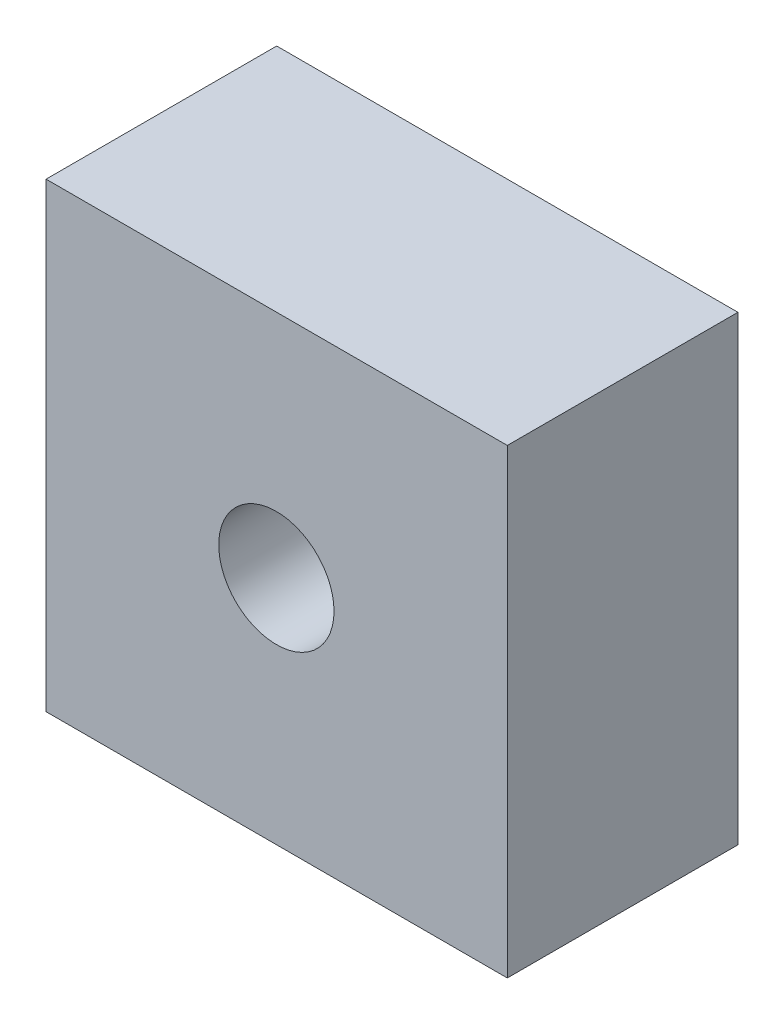
ISO-10303-21;
HEADER;
FILE_DESCRIPTION(('STEP AP214'),'2;1');
FILE_NAME('part.step','',(''),(''),'','','');
FILE_SCHEMA(('AUTOMOTIVE_DESIGN { 1 0 10303 214 1 1 1 1 }'));
ENDSEC;
DATA;
#1=APPLICATION_CONTEXT('core data for automotive mechanical design processes');
#2=APPLICATION_PROTOCOL_DEFINITION('international standard','automotive_design',2000,#1);
#3=PRODUCT_CONTEXT('',#1,'mechanical');
#4=PRODUCT('Part','Part','',(#3));
#5=PRODUCT_RELATED_PRODUCT_CATEGORY('part','',(#4));
#6=PRODUCT_DEFINITION_FORMATION('','',#4);
#7=PRODUCT_DEFINITION_CONTEXT('part definition',#1,'design');
#8=PRODUCT_DEFINITION('design','',#6,#7);
#9=PRODUCT_DEFINITION_SHAPE('','',#8);
#10=(LENGTH_UNIT() NAMED_UNIT(*) SI_UNIT(.MILLI.,.METRE.));
#11=(NAMED_UNIT(*) PLANE_ANGLE_UNIT() SI_UNIT($,.RADIAN.));
#12=(NAMED_UNIT(*) SI_UNIT($,.STERADIAN.) SOLID_ANGLE_UNIT());
#13=UNCERTAINTY_MEASURE_WITH_UNIT(LENGTH_MEASURE(1.E-05),#10,'distance_accuracy_value','');
#14=(GEOMETRIC_REPRESENTATION_CONTEXT(3) GLOBAL_UNCERTAINTY_ASSIGNED_CONTEXT((#13)) GLOBAL_UNIT_ASSIGNED_CONTEXT((#10,
#11,#12)) REPRESENTATION_CONTEXT('',''));
#15=CARTESIAN_POINT('',(0.,0.,0.));
#16=DIRECTION('',(0.,0.,1.));
#17=DIRECTION('',(1.,0.,0.));
#18=AXIS2_PLACEMENT_3D('',#15,#16,#17);
#19=CARTESIAN_POINT('',(0.,0.,10.));
#20=DIRECTION('',(1.,0.,0.));
#21=DIRECTION('',(0.,0.,-1.));
#22=AXIS2_PLACEMENT_3D('',#19,#20,#21);
#23=PLANE('',#22);
#24=DIRECTION('',(0.,-1.,0.));
#25=VECTOR('',#24,1.);
#26=CARTESIAN_POINT('',(0.,0.,0.));
#27=LINE('',#26,#25);
#28=CARTESIAN_POINT('',(0.,20.,0.));
#29=VERTEX_POINT('',#28);
#30=CARTESIAN_POINT('',(0.,0.,0.));
#31=VERTEX_POINT('',#30);
#32=EDGE_CURVE('E104',#29,#31,#27,.T.);
#33=ORIENTED_EDGE('',*,*,#32,.T.);
#34=DIRECTION('',(0.,0.,-1.));
#35=VECTOR('',#34,1.);
#36=CARTESIAN_POINT('',(0.,0.,10.));
#37=LINE('',#36,#35);
#38=CARTESIAN_POINT('',(0.,0.,10.));
#39=VERTEX_POINT('',#38);
#40=EDGE_CURVE('E11',#39,#31,#37,.T.);
#41=ORIENTED_EDGE('',*,*,#40,.F.);
#42=DIRECTION('',(0.,-1.,0.));
#43=VECTOR('',#42,1.);
#44=CARTESIAN_POINT('',(0.,0.,10.));
#45=LINE('',#44,#43);
#46=CARTESIAN_POINT('',(0.,20.,10.));
#47=VERTEX_POINT('',#46);
#48=EDGE_CURVE('E91',#47,#39,#45,.T.);
#49=ORIENTED_EDGE('',*,*,#48,.F.);
#50=DIRECTION('',(0.,0.,-1.));
#51=VECTOR('',#50,1.);
#52=CARTESIAN_POINT('',(0.,20.,10.));
#53=LINE('',#52,#51);
#54=EDGE_CURVE('E101',#47,#29,#53,.T.);
#55=ORIENTED_EDGE('',*,*,#54,.T.);
#56=EDGE_LOOP('',(#33,#41,#49,#55));
#57=FACE_BOUND('',#56,.T.);
#58=ADVANCED_FACE('F45',(#57),#23,.F.);
#59=CARTESIAN_POINT('',(0.,0.,10.));
#60=DIRECTION('',(0.,1.,0.));
#61=DIRECTION('',(0.,0.,1.));
#62=AXIS2_PLACEMENT_3D('',#59,#60,#61);
#63=PLANE('',#62);
#64=DIRECTION('',(1.,0.,0.));
#65=VECTOR('',#64,1.);
#66=CARTESIAN_POINT('',(0.,0.,0.));
#67=LINE('',#66,#65);
#68=CARTESIAN_POINT('',(20.,0.,0.));
#69=VERTEX_POINT('',#68);
#70=EDGE_CURVE('E100',#31,#69,#67,.T.);
#71=ORIENTED_EDGE('',*,*,#70,.T.);
#72=DIRECTION('',(0.,0.,-1.));
#73=VECTOR('',#72,1.);
#74=CARTESIAN_POINT('',(20.,0.,10.));
#75=LINE('',#74,#73);
#76=CARTESIAN_POINT('',(20.,0.,10.));
#77=VERTEX_POINT('',#76);
#78=EDGE_CURVE('E49',#77,#69,#75,.T.);
#79=ORIENTED_EDGE('',*,*,#78,.F.);
#80=DIRECTION('',(1.,0.,0.));
#81=VECTOR('',#80,1.);
#82=CARTESIAN_POINT('',(0.,0.,10.));
#83=LINE('',#82,#81);
#84=EDGE_CURVE('E86',#39,#77,#83,.T.);
#85=ORIENTED_EDGE('',*,*,#84,.F.);
#86=ORIENTED_EDGE('',*,*,#40,.T.);
#87=EDGE_LOOP('',(#71,#79,#85,#86));
#88=FACE_BOUND('',#87,.T.);
#89=ADVANCED_FACE('F96',(#88),#63,.F.);
#90=CARTESIAN_POINT('',(20.,0.,10.));
#91=DIRECTION('',(-1.,0.,0.));
#92=DIRECTION('',(0.,0.,1.));
#93=AXIS2_PLACEMENT_3D('',#90,#91,#92);
#94=PLANE('',#93);
#95=DIRECTION('',(0.,1.,0.));
#96=VECTOR('',#95,1.);
#97=CARTESIAN_POINT('',(20.,0.,0.));
#98=LINE('',#97,#96);
#99=CARTESIAN_POINT('',(20.,20.,0.));
#100=VERTEX_POINT('',#99);
#101=EDGE_CURVE('E73',#69,#100,#98,.T.);
#102=ORIENTED_EDGE('',*,*,#101,.T.);
#103=DIRECTION('',(0.,0.,-1.));
#104=VECTOR('',#103,1.);
#105=CARTESIAN_POINT('',(20.,20.,10.));
#106=LINE('',#105,#104);
#107=CARTESIAN_POINT('',(20.,20.,10.));
#108=VERTEX_POINT('',#107);
#109=EDGE_CURVE('E98',#108,#100,#106,.T.);
#110=ORIENTED_EDGE('',*,*,#109,.F.);
#111=DIRECTION('',(0.,1.,0.));
#112=VECTOR('',#111,1.);
#113=CARTESIAN_POINT('',(20.,0.,10.));
#114=LINE('',#113,#112);
#115=EDGE_CURVE('E93',#77,#108,#114,.T.);
#116=ORIENTED_EDGE('',*,*,#115,.F.);
#117=ORIENTED_EDGE('',*,*,#78,.T.);
#118=EDGE_LOOP('',(#102,#110,#116,#117));
#119=FACE_BOUND('',#118,.T.);
#120=ADVANCED_FACE('F97',(#119),#94,.F.);
#121=CARTESIAN_POINT('',(0.,20.,10.));
#122=DIRECTION('',(0.,-1.,0.));
#123=DIRECTION('',(0.,0.,-1.));
#124=AXIS2_PLACEMENT_3D('',#121,#122,#123);
#125=PLANE('',#124);
#126=DIRECTION('',(-1.,0.,0.));
#127=VECTOR('',#126,1.);
#128=CARTESIAN_POINT('',(0.,20.,0.));
#129=LINE('',#128,#127);
#130=EDGE_CURVE('E81',#100,#29,#129,.T.);
#131=ORIENTED_EDGE('',*,*,#130,.T.);
#132=ORIENTED_EDGE('',*,*,#54,.F.);
#133=DIRECTION('',(-1.,0.,0.));
#134=VECTOR('',#133,1.);
#135=CARTESIAN_POINT('',(0.,20.,10.));
#136=LINE('',#135,#134);
#137=EDGE_CURVE('E59',#108,#47,#136,.T.);
#138=ORIENTED_EDGE('',*,*,#137,.F.);
#139=ORIENTED_EDGE('',*,*,#109,.T.);
#140=EDGE_LOOP('',(#131,#132,#138,#139));
#141=FACE_BOUND('',#140,.T.);
#142=ADVANCED_FACE('F114',(#141),#125,.F.);
#143=CARTESIAN_POINT('',(0.,0.,10.));
#144=DIRECTION('',(0.,0.,-1.));
#145=DIRECTION('',(-1.,0.,0.));
#146=AXIS2_PLACEMENT_3D('',#143,#144,#145);
#147=PLANE('',#146);
#148=CARTESIAN_POINT('',(9.98648737498797,10.0143055988724,10.));
#149=DIRECTION('',(0.,0.,1.));
#150=DIRECTION('',(1.,0.,0.));
#151=AXIS2_PLACEMENT_3D('',#148,#149,#150);
#152=CIRCLE('',#151,2.50000000000001);
#153=CARTESIAN_POINT('',(12.486487374988,10.0143055988724,10.));
#154=VERTEX_POINT('',#153);
#155=EDGE_CURVE('E123',#154,#154,#152,.T.);
#156=ORIENTED_EDGE('',*,*,#155,.F.);
#157=EDGE_LOOP('',(#156));
#158=FACE_BOUND('',#157,.T.);
#159=ORIENTED_EDGE('',*,*,#48,.T.);
#160=ORIENTED_EDGE('',*,*,#84,.T.);
#161=ORIENTED_EDGE('',*,*,#115,.T.);
#162=ORIENTED_EDGE('',*,*,#137,.T.);
#163=EDGE_LOOP('',(#159,#160,#161,#162));
#164=FACE_BOUND('',#163,.T.);
#165=ADVANCED_FACE('F90',(#158,#164),#147,.F.);
#166=CARTESIAN_POINT('',(0.,0.,0.));
#167=DIRECTION('',(0.,0.,-1.));
#168=DIRECTION('',(-1.,0.,0.));
#169=AXIS2_PLACEMENT_3D('',#166,#167,#168);
#170=PLANE('',#169);
#171=CARTESIAN_POINT('',(9.98648737498797,10.0143055988724,0.));
#172=DIRECTION('',(0.,0.,1.));
#173=DIRECTION('',(1.,0.,0.));
#174=AXIS2_PLACEMENT_3D('',#171,#172,#173);
#175=CIRCLE('',#174,2.50000000000001);
#176=CARTESIAN_POINT('',(12.486487374988,10.0143055988724,0.));
#177=VERTEX_POINT('',#176);
#178=EDGE_CURVE('E107',#177,#177,#175,.T.);
#179=ORIENTED_EDGE('',*,*,#178,.T.);
#180=EDGE_LOOP('',(#179));
#181=FACE_BOUND('',#180,.T.);
#182=ORIENTED_EDGE('',*,*,#32,.F.);
#183=ORIENTED_EDGE('',*,*,#130,.F.);
#184=ORIENTED_EDGE('',*,*,#101,.F.);
#185=ORIENTED_EDGE('',*,*,#70,.F.);
#186=EDGE_LOOP('',(#182,#183,#184,#185));
#187=FACE_BOUND('',#186,.T.);
#188=ADVANCED_FACE('F118',(#181,#187),#170,.T.);
#189=CARTESIAN_POINT('',(9.98648737498797,10.0143055988724,10.));
#190=DIRECTION('',(0.,0.,1.));
#191=DIRECTION('',(1.,0.,0.));
#192=AXIS2_PLACEMENT_3D('',#189,#190,#191);
#193=CYLINDRICAL_SURFACE('',#192,2.50000000000001);
#194=ORIENTED_EDGE('',*,*,#178,.F.);
#195=EDGE_LOOP('',(#194));
#196=FACE_BOUND('',#195,.T.);
#197=ORIENTED_EDGE('',*,*,#155,.T.);
#198=EDGE_LOOP('',(#197));
#199=FACE_BOUND('',#198,.T.);
#200=ADVANCED_FACE('F122',(#196,#199),#193,.F.);
#201=CLOSED_SHELL('',(#58,#89,#120,#142,#165,#188,#200));
#202=MANIFOLD_SOLID_BREP('B2',#201);
#203=ADVANCED_BREP_SHAPE_REPRESENTATION('',(#18,#202),#14);
#204=SHAPE_DEFINITION_REPRESENTATION(#9,#203);
ENDSEC;
END-ISO-10303-21;
